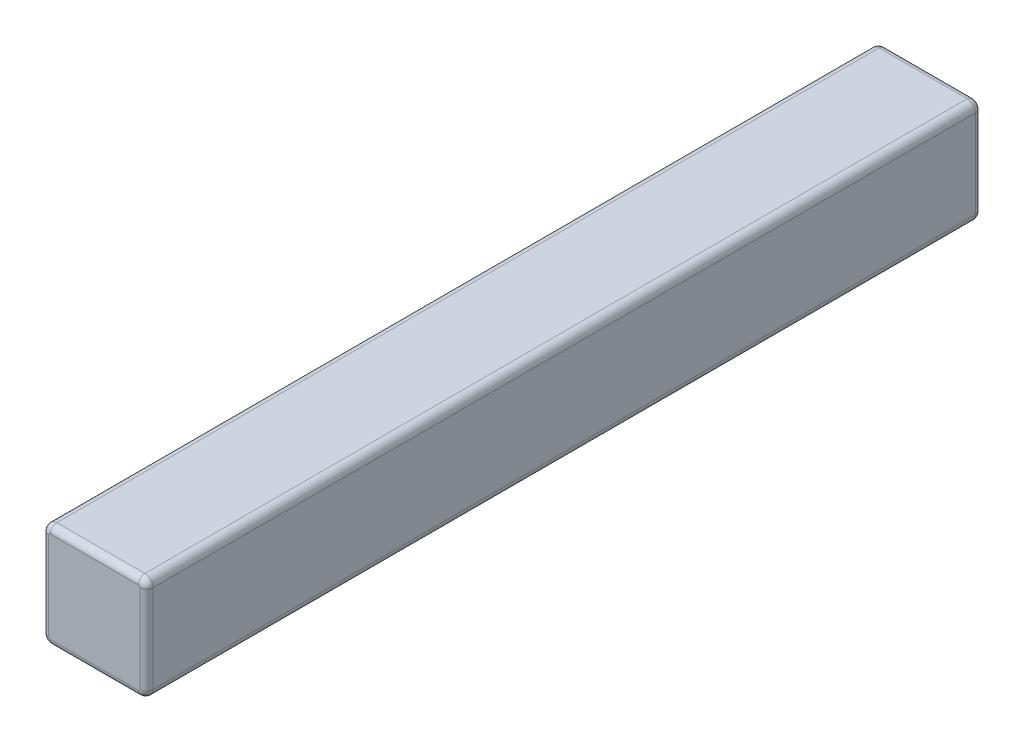
ISO-10303-21;
HEADER;
FILE_DESCRIPTION(('STEP AP214'),'2;1');
FILE_NAME('part.step','',(''),(''),'','','');
FILE_SCHEMA(('AUTOMOTIVE_DESIGN { 1 0 10303 214 1 1 1 1 }'));
ENDSEC;
DATA;
#1=APPLICATION_CONTEXT('core data for automotive mechanical design processes');
#2=APPLICATION_PROTOCOL_DEFINITION('international standard','automotive_design',2000,#1);
#3=PRODUCT_CONTEXT('',#1,'mechanical');
#4=PRODUCT('Part','Part','',(#3));
#5=PRODUCT_RELATED_PRODUCT_CATEGORY('part','',(#4));
#6=PRODUCT_DEFINITION_FORMATION('','',#4);
#7=PRODUCT_DEFINITION_CONTEXT('part definition',#1,'design');
#8=PRODUCT_DEFINITION('design','',#6,#7);
#9=PRODUCT_DEFINITION_SHAPE('','',#8);
#10=(LENGTH_UNIT() NAMED_UNIT(*) SI_UNIT(.MILLI.,.METRE.));
#11=(NAMED_UNIT(*) PLANE_ANGLE_UNIT() SI_UNIT($,.RADIAN.));
#12=(NAMED_UNIT(*) SI_UNIT($,.STERADIAN.) SOLID_ANGLE_UNIT());
#13=UNCERTAINTY_MEASURE_WITH_UNIT(LENGTH_MEASURE(1.E-05),#10,'distance_accuracy_value','');
#14=(GEOMETRIC_REPRESENTATION_CONTEXT(3) GLOBAL_UNCERTAINTY_ASSIGNED_CONTEXT((#13)) GLOBAL_UNIT_ASSIGNED_CONTEXT((#10,
#11,#12)) REPRESENTATION_CONTEXT('',''));
#15=CARTESIAN_POINT('',(0.,0.,0.));
#16=DIRECTION('',(0.,0.,1.));
#17=DIRECTION('',(1.,0.,0.));
#18=AXIS2_PLACEMENT_3D('',#15,#16,#17);
#19=CARTESIAN_POINT('',(-1.3375,1.3375,25.4));
#20=DIRECTION('',(0.,0.,-1.));
#21=DIRECTION('',(-1.,0.,0.));
#22=AXIS2_PLACEMENT_3D('',#19,#20,#21);
#23=CYLINDRICAL_SURFACE('',#22,0.25);
#24=DIRECTION('',(0.,0.,-1.));
#25=VECTOR('',#24,1.);
#26=CARTESIAN_POINT('',(-1.3375,1.5875,25.4));
#27=LINE('',#26,#25);
#28=CARTESIAN_POINT('',(-1.3375,1.5875,25.2));
#29=VERTEX_POINT('',#28);
#30=CARTESIAN_POINT('',(-1.3375,1.5875,0.199999999999999));
#31=VERTEX_POINT('',#30);
#32=EDGE_CURVE('E267',#29,#31,#27,.T.);
#33=ORIENTED_EDGE('',*,*,#32,.T.);
#34=CARTESIAN_POINT('',(-1.3375,1.3375,0.199999999999999));
#35=DIRECTION('',(0.,0.,1.));
#36=DIRECTION('',(1.,0.,0.));
#37=AXIS2_PLACEMENT_3D('',#34,#35,#36);
#38=CIRCLE('',#37,0.25);
#39=CARTESIAN_POINT('',(-1.5875,1.3375,0.199999999999999));
#40=VERTEX_POINT('',#39);
#41=EDGE_CURVE('E232',#31,#40,#38,.T.);
#42=ORIENTED_EDGE('',*,*,#41,.T.);
#43=DIRECTION('',(0.,0.,-1.));
#44=VECTOR('',#43,1.);
#45=CARTESIAN_POINT('',(-1.5875,1.3375,25.4));
#46=LINE('',#45,#44);
#47=CARTESIAN_POINT('',(-1.5875,1.3375,25.2));
#48=VERTEX_POINT('',#47);
#49=EDGE_CURVE('E171',#48,#40,#46,.T.);
#50=ORIENTED_EDGE('',*,*,#49,.F.);
#51=CARTESIAN_POINT('',(-1.3375,1.3375,25.2));
#52=DIRECTION('',(0.,0.,1.));
#53=DIRECTION('',(1.,0.,0.));
#54=AXIS2_PLACEMENT_3D('',#51,#52,#53);
#55=CIRCLE('',#54,0.25);
#56=EDGE_CURVE('E230',#48,#29,#55,.F.);
#57=ORIENTED_EDGE('',*,*,#56,.T.);
#58=EDGE_LOOP('',(#33,#42,#50,#57));
#59=FACE_BOUND('',#58,.T.);
#60=ADVANCED_FACE('F35',(#59),#23,.T.);
#61=CARTESIAN_POINT('',(-1.5875,1.3375,25.4));
#62=DIRECTION('',(1.,0.,0.));
#63=DIRECTION('',(0.,0.,-1.));
#64=AXIS2_PLACEMENT_3D('',#61,#62,#63);
#65=PLANE('',#64);
#66=ORIENTED_EDGE('',*,*,#49,.T.);
#67=DIRECTION('',(0.,-1.,0.));
#68=VECTOR('',#67,1.);
#69=CARTESIAN_POINT('',(-1.5875,1.3375,0.199999999999999));
#70=LINE('',#69,#68);
#71=CARTESIAN_POINT('',(-1.5875,-1.3375,0.199999999999999));
#72=VERTEX_POINT('',#71);
#73=EDGE_CURVE('E170',#40,#72,#70,.T.);
#74=ORIENTED_EDGE('',*,*,#73,.T.);
#75=DIRECTION('',(0.,0.,-1.));
#76=VECTOR('',#75,1.);
#77=CARTESIAN_POINT('',(-1.5875,-1.3375,25.4));
#78=LINE('',#77,#76);
#79=CARTESIAN_POINT('',(-1.5875,-1.3375,25.2));
#80=VERTEX_POINT('',#79);
#81=EDGE_CURVE('E152',#80,#72,#78,.T.);
#82=ORIENTED_EDGE('',*,*,#81,.F.);
#83=DIRECTION('',(0.,-1.,0.));
#84=VECTOR('',#83,1.);
#85=CARTESIAN_POINT('',(-1.5875,1.3375,25.2));
#86=LINE('',#85,#84);
#87=EDGE_CURVE('E167',#80,#48,#86,.F.);
#88=ORIENTED_EDGE('',*,*,#87,.T.);
#89=EDGE_LOOP('',(#66,#74,#82,#88));
#90=FACE_BOUND('',#89,.T.);
#91=ADVANCED_FACE('F165',(#90),#65,.F.);
#92=CARTESIAN_POINT('',(-1.3375,-1.3375,25.4));
#93=DIRECTION('',(0.,0.,-1.));
#94=DIRECTION('',(-1.,0.,0.));
#95=AXIS2_PLACEMENT_3D('',#92,#93,#94);
#96=CYLINDRICAL_SURFACE('',#95,0.25);
#97=ORIENTED_EDGE('',*,*,#81,.T.);
#98=CARTESIAN_POINT('',(-1.3375,-1.3375,0.199999999999999));
#99=DIRECTION('',(0.,0.,1.));
#100=DIRECTION('',(1.,0.,0.));
#101=AXIS2_PLACEMENT_3D('',#98,#99,#100);
#102=CIRCLE('',#101,0.25);
#103=CARTESIAN_POINT('',(-1.3375,-1.5875,0.199999999999999));
#104=VERTEX_POINT('',#103);
#105=EDGE_CURVE('E159',#72,#104,#102,.T.);
#106=ORIENTED_EDGE('',*,*,#105,.T.);
#107=DIRECTION('',(0.,0.,-1.));
#108=VECTOR('',#107,1.);
#109=CARTESIAN_POINT('',(-1.3375,-1.5875,25.4));
#110=LINE('',#109,#108);
#111=CARTESIAN_POINT('',(-1.3375,-1.5875,25.2));
#112=VERTEX_POINT('',#111);
#113=EDGE_CURVE('E154',#112,#104,#110,.T.);
#114=ORIENTED_EDGE('',*,*,#113,.F.);
#115=CARTESIAN_POINT('',(-1.3375,-1.3375,25.2));
#116=DIRECTION('',(0.,0.,1.));
#117=DIRECTION('',(1.,0.,0.));
#118=AXIS2_PLACEMENT_3D('',#115,#116,#117);
#119=CIRCLE('',#118,0.25);
#120=EDGE_CURVE('E149',#112,#80,#119,.F.);
#121=ORIENTED_EDGE('',*,*,#120,.T.);
#122=EDGE_LOOP('',(#97,#106,#114,#121));
#123=FACE_BOUND('',#122,.T.);
#124=ADVANCED_FACE('F151',(#123),#96,.T.);
#125=CARTESIAN_POINT('',(-1.3375,-1.5875,25.4));
#126=DIRECTION('',(0.,1.,0.));
#127=DIRECTION('',(-1.,0.,0.));
#128=AXIS2_PLACEMENT_3D('',#125,#126,#127);
#129=PLANE('',#128);
#130=ORIENTED_EDGE('',*,*,#113,.T.);
#131=DIRECTION('',(1.,0.,0.));
#132=VECTOR('',#131,1.);
#133=CARTESIAN_POINT('',(-1.3375,-1.5875,0.199999999999999));
#134=LINE('',#133,#132);
#135=CARTESIAN_POINT('',(1.3375,-1.5875,0.199999999999999));
#136=VERTEX_POINT('',#135);
#137=EDGE_CURVE('E211',#104,#136,#134,.T.);
#138=ORIENTED_EDGE('',*,*,#137,.T.);
#139=DIRECTION('',(0.,0.,-1.));
#140=VECTOR('',#139,1.);
#141=CARTESIAN_POINT('',(1.3375,-1.5875,25.4));
#142=LINE('',#141,#140);
#143=CARTESIAN_POINT('',(1.3375,-1.5875,25.2));
#144=VERTEX_POINT('',#143);
#145=EDGE_CURVE('E311',#144,#136,#142,.T.);
#146=ORIENTED_EDGE('',*,*,#145,.F.);
#147=DIRECTION('',(1.,0.,0.));
#148=VECTOR('',#147,1.);
#149=CARTESIAN_POINT('',(-1.3375,-1.5875,25.2));
#150=LINE('',#149,#148);
#151=EDGE_CURVE('E209',#144,#112,#150,.F.);
#152=ORIENTED_EDGE('',*,*,#151,.T.);
#153=EDGE_LOOP('',(#130,#138,#146,#152));
#154=FACE_BOUND('',#153,.T.);
#155=ADVANCED_FACE('F316',(#154),#129,.F.);
#156=CARTESIAN_POINT('',(1.3375,-1.3375,25.4));
#157=DIRECTION('',(0.,0.,-1.));
#158=DIRECTION('',(-1.,0.,0.));
#159=AXIS2_PLACEMENT_3D('',#156,#157,#158);
#160=CYLINDRICAL_SURFACE('',#159,0.25);
#161=ORIENTED_EDGE('',*,*,#145,.T.);
#162=CARTESIAN_POINT('',(1.3375,-1.3375,0.199999999999999));
#163=DIRECTION('',(0.,0.,1.));
#164=DIRECTION('',(1.,0.,0.));
#165=AXIS2_PLACEMENT_3D('',#162,#163,#164);
#166=CIRCLE('',#165,0.25);
#167=CARTESIAN_POINT('',(1.5875,-1.3375,0.199999999999999));
#168=VERTEX_POINT('',#167);
#169=EDGE_CURVE('E215',#136,#168,#166,.T.);
#170=ORIENTED_EDGE('',*,*,#169,.T.);
#171=DIRECTION('',(0.,0.,-1.));
#172=VECTOR('',#171,1.);
#173=CARTESIAN_POINT('',(1.5875,-1.3375,25.4));
#174=LINE('',#173,#172);
#175=CARTESIAN_POINT('',(1.5875,-1.3375,25.2));
#176=VERTEX_POINT('',#175);
#177=EDGE_CURVE('E308',#176,#168,#174,.T.);
#178=ORIENTED_EDGE('',*,*,#177,.F.);
#179=CARTESIAN_POINT('',(1.3375,-1.3375,25.2));
#180=DIRECTION('',(0.,0.,1.));
#181=DIRECTION('',(1.,0.,0.));
#182=AXIS2_PLACEMENT_3D('',#179,#180,#181);
#183=CIRCLE('',#182,0.25);
#184=EDGE_CURVE('E213',#176,#144,#183,.F.);
#185=ORIENTED_EDGE('',*,*,#184,.T.);
#186=EDGE_LOOP('',(#161,#170,#178,#185));
#187=FACE_BOUND('',#186,.T.);
#188=ADVANCED_FACE('F358',(#187),#160,.T.);
#189=CARTESIAN_POINT('',(1.5875,1.3375,25.4));
#190=DIRECTION('',(1.,0.,0.));
#191=DIRECTION('',(0.,1.,0.));
#192=AXIS2_PLACEMENT_3D('',#189,#190,#191);
#193=PLANE('',#192);
#194=ORIENTED_EDGE('',*,*,#177,.T.);
#195=DIRECTION('',(0.,-1.,0.));
#196=VECTOR('',#195,1.);
#197=CARTESIAN_POINT('',(1.5875,1.3375,0.2));
#198=LINE('',#197,#196);
#199=CARTESIAN_POINT('',(1.5875,1.3375,0.199999999999999));
#200=VERTEX_POINT('',#199);
#201=EDGE_CURVE('E219',#168,#200,#198,.F.);
#202=ORIENTED_EDGE('',*,*,#201,.T.);
#203=DIRECTION('',(0.,0.,-1.));
#204=VECTOR('',#203,1.);
#205=CARTESIAN_POINT('',(1.5875,1.3375,25.4));
#206=LINE('',#205,#204);
#207=CARTESIAN_POINT('',(1.5875,1.3375,25.2));
#208=VERTEX_POINT('',#207);
#209=EDGE_CURVE('E303',#208,#200,#206,.T.);
#210=ORIENTED_EDGE('',*,*,#209,.F.);
#211=DIRECTION('',(0.,-1.,0.));
#212=VECTOR('',#211,1.);
#213=CARTESIAN_POINT('',(1.5875,1.3375,25.2));
#214=LINE('',#213,#212);
#215=EDGE_CURVE('E217',#208,#176,#214,.T.);
#216=ORIENTED_EDGE('',*,*,#215,.T.);
#217=EDGE_LOOP('',(#194,#202,#210,#216));
#218=FACE_BOUND('',#217,.T.);
#219=ADVANCED_FACE('F360',(#218),#193,.T.);
#220=CARTESIAN_POINT('',(1.3375,1.3375,25.4));
#221=DIRECTION('',(0.,0.,-1.));
#222=DIRECTION('',(-1.,0.,0.));
#223=AXIS2_PLACEMENT_3D('',#220,#221,#222);
#224=CYLINDRICAL_SURFACE('',#223,0.25);
#225=ORIENTED_EDGE('',*,*,#209,.T.);
#226=CARTESIAN_POINT('',(1.3375,1.3375,0.199999999999999));
#227=DIRECTION('',(0.,0.,1.));
#228=DIRECTION('',(1.,0.,0.));
#229=AXIS2_PLACEMENT_3D('',#226,#227,#228);
#230=CIRCLE('',#229,0.25);
#231=CARTESIAN_POINT('',(1.3375,1.5875,0.199999999999999));
#232=VERTEX_POINT('',#231);
#233=EDGE_CURVE('E223',#200,#232,#230,.T.);
#234=ORIENTED_EDGE('',*,*,#233,.T.);
#235=DIRECTION('',(0.,0.,-1.));
#236=VECTOR('',#235,1.);
#237=CARTESIAN_POINT('',(1.3375,1.5875,25.4));
#238=LINE('',#237,#236);
#239=CARTESIAN_POINT('',(1.3375,1.5875,25.2));
#240=VERTEX_POINT('',#239);
#241=EDGE_CURVE('E301',#240,#232,#238,.T.);
#242=ORIENTED_EDGE('',*,*,#241,.F.);
#243=CARTESIAN_POINT('',(1.3375,1.3375,25.2));
#244=DIRECTION('',(0.,0.,1.));
#245=DIRECTION('',(1.,0.,0.));
#246=AXIS2_PLACEMENT_3D('',#243,#244,#245);
#247=CIRCLE('',#246,0.25);
#248=EDGE_CURVE('E221',#240,#208,#247,.F.);
#249=ORIENTED_EDGE('',*,*,#248,.T.);
#250=EDGE_LOOP('',(#225,#234,#242,#249));
#251=FACE_BOUND('',#250,.T.);
#252=ADVANCED_FACE('F411',(#251),#224,.T.);
#253=CARTESIAN_POINT('',(-1.3375,1.5875,25.4));
#254=DIRECTION('',(0.,1.,0.));
#255=DIRECTION('',(-1.,0.,0.));
#256=AXIS2_PLACEMENT_3D('',#253,#254,#255);
#257=PLANE('',#256);
#258=ORIENTED_EDGE('',*,*,#241,.T.);
#259=DIRECTION('',(1.,0.,0.));
#260=VECTOR('',#259,1.);
#261=CARTESIAN_POINT('',(-1.3375,1.5875,0.2));
#262=LINE('',#261,#260);
#263=EDGE_CURVE('E228',#232,#31,#262,.F.);
#264=ORIENTED_EDGE('',*,*,#263,.T.);
#265=ORIENTED_EDGE('',*,*,#32,.F.);
#266=DIRECTION('',(1.,0.,0.));
#267=VECTOR('',#266,1.);
#268=CARTESIAN_POINT('',(-1.3375,1.5875,25.2));
#269=LINE('',#268,#267);
#270=EDGE_CURVE('E225',#29,#240,#269,.T.);
#271=ORIENTED_EDGE('',*,*,#270,.T.);
#272=EDGE_LOOP('',(#258,#264,#265,#271));
#273=FACE_BOUND('',#272,.T.);
#274=ADVANCED_FACE('F298',(#273),#257,.T.);
#275=CARTESIAN_POINT('',(-1.3375,1.3375,25.4));
#276=DIRECTION('',(0.,0.,1.));
#277=DIRECTION('',(1.,0.,0.));
#278=AXIS2_PLACEMENT_3D('',#275,#276,#277);
#279=PLANE('',#278);
#280=CARTESIAN_POINT('',(1.3375,1.3375,25.4));
#281=DIRECTION('',(0.,0.,1.));
#282=DIRECTION('',(1.,0.,0.));
#283=AXIS2_PLACEMENT_3D('',#280,#281,#282);
#284=CIRCLE('',#283,0.0499999999999999);
#285=CARTESIAN_POINT('',(1.3875,1.3375,25.4));
#286=VERTEX_POINT('',#285);
#287=CARTESIAN_POINT('',(1.3375,1.3875,25.4));
#288=VERTEX_POINT('',#287);
#289=EDGE_CURVE('E44',#286,#288,#284,.T.);
#290=ORIENTED_EDGE('',*,*,#289,.T.);
#291=DIRECTION('',(1.,0.,0.));
#292=VECTOR('',#291,1.);
#293=CARTESIAN_POINT('',(-1.3375,1.3875,25.4));
#294=LINE('',#293,#292);
#295=CARTESIAN_POINT('',(-1.3375,1.3875,25.4));
#296=VERTEX_POINT('',#295);
#297=EDGE_CURVE('E11',#288,#296,#294,.F.);
#298=ORIENTED_EDGE('',*,*,#297,.T.);
#299=CARTESIAN_POINT('',(-1.3375,1.3375,25.4));
#300=DIRECTION('',(0.,0.,1.));
#301=DIRECTION('',(1.,0.,0.));
#302=AXIS2_PLACEMENT_3D('',#299,#300,#301);
#303=CIRCLE('',#302,0.0500000000000001);
#304=CARTESIAN_POINT('',(-1.3875,1.3375,25.4));
#305=VERTEX_POINT('',#304);
#306=EDGE_CURVE('E234',#296,#305,#303,.T.);
#307=ORIENTED_EDGE('',*,*,#306,.T.);
#308=DIRECTION('',(0.,-1.,0.));
#309=VECTOR('',#308,1.);
#310=CARTESIAN_POINT('',(-1.3875,-1.3375,25.4));
#311=LINE('',#310,#309);
#312=CARTESIAN_POINT('',(-1.3875,-1.3375,25.4));
#313=VERTEX_POINT('',#312);
#314=EDGE_CURVE('E236',#305,#313,#311,.T.);
#315=ORIENTED_EDGE('',*,*,#314,.T.);
#316=CARTESIAN_POINT('',(-1.3375,-1.3375,25.4));
#317=DIRECTION('',(0.,0.,1.));
#318=DIRECTION('',(1.,0.,0.));
#319=AXIS2_PLACEMENT_3D('',#316,#317,#318);
#320=CIRCLE('',#319,0.05);
#321=CARTESIAN_POINT('',(-1.3375,-1.3875,25.4));
#322=VERTEX_POINT('',#321);
#323=EDGE_CURVE('E177',#313,#322,#320,.T.);
#324=ORIENTED_EDGE('',*,*,#323,.T.);
#325=DIRECTION('',(1.,0.,0.));
#326=VECTOR('',#325,1.);
#327=CARTESIAN_POINT('',(1.3375,-1.3875,25.4));
#328=LINE('',#327,#326);
#329=CARTESIAN_POINT('',(1.3375,-1.3875,25.4));
#330=VERTEX_POINT('',#329);
#331=EDGE_CURVE('E239',#322,#330,#328,.T.);
#332=ORIENTED_EDGE('',*,*,#331,.T.);
#333=CARTESIAN_POINT('',(1.3375,-1.3375,25.4));
#334=DIRECTION('',(0.,0.,1.));
#335=DIRECTION('',(1.,0.,0.));
#336=AXIS2_PLACEMENT_3D('',#333,#334,#335);
#337=CIRCLE('',#336,0.0499999999999997);
#338=CARTESIAN_POINT('',(1.3875,-1.3375,25.4));
#339=VERTEX_POINT('',#338);
#340=EDGE_CURVE('E241',#330,#339,#337,.T.);
#341=ORIENTED_EDGE('',*,*,#340,.T.);
#342=DIRECTION('',(0.,-1.,0.));
#343=VECTOR('',#342,1.);
#344=CARTESIAN_POINT('',(1.3875,1.3375,25.4));
#345=LINE('',#344,#343);
#346=EDGE_CURVE('E55',#339,#286,#345,.F.);
#347=ORIENTED_EDGE('',*,*,#346,.T.);
#348=EDGE_LOOP('',(#290,#298,#307,#315,#324,#332,#341,#347));
#349=FACE_BOUND('',#348,.T.);
#350=ADVANCED_FACE('F285',(#349),#279,.T.);
#351=CARTESIAN_POINT('',(-1.3375,1.3375,0.));
#352=DIRECTION('',(0.,0.,1.));
#353=DIRECTION('',(1.,0.,0.));
#354=AXIS2_PLACEMENT_3D('',#351,#352,#353);
#355=PLANE('',#354);
#356=CARTESIAN_POINT('',(-1.3375,-1.3375,0.));
#357=DIRECTION('',(0.,0.,1.));
#358=DIRECTION('',(1.,0.,0.));
#359=AXIS2_PLACEMENT_3D('',#356,#357,#358);
#360=CIRCLE('',#359,0.05);
#361=CARTESIAN_POINT('',(-1.3375,-1.3875,0.));
#362=VERTEX_POINT('',#361);
#363=CARTESIAN_POINT('',(-1.3875,-1.3375,0.));
#364=VERTEX_POINT('',#363);
#365=EDGE_CURVE('E204',#362,#364,#360,.F.);
#366=ORIENTED_EDGE('',*,*,#365,.T.);
#367=DIRECTION('',(0.,-1.,0.));
#368=VECTOR('',#367,1.);
#369=CARTESIAN_POINT('',(-1.3875,1.3375,0.));
#370=LINE('',#369,#368);
#371=CARTESIAN_POINT('',(-1.3875,1.3375,0.));
#372=VERTEX_POINT('',#371);
#373=EDGE_CURVE('E160',#364,#372,#370,.F.);
#374=ORIENTED_EDGE('',*,*,#373,.T.);
#375=CARTESIAN_POINT('',(-1.3375,1.3375,0.));
#376=DIRECTION('',(0.,0.,1.));
#377=DIRECTION('',(1.,0.,0.));
#378=AXIS2_PLACEMENT_3D('',#375,#376,#377);
#379=CIRCLE('',#378,0.0500000000000001);
#380=CARTESIAN_POINT('',(-1.3375,1.3875,0.));
#381=VERTEX_POINT('',#380);
#382=EDGE_CURVE('E189',#372,#381,#379,.F.);
#383=ORIENTED_EDGE('',*,*,#382,.T.);
#384=DIRECTION('',(1.,0.,0.));
#385=VECTOR('',#384,1.);
#386=CARTESIAN_POINT('',(1.3375,1.3875,0.));
#387=LINE('',#386,#385);
#388=CARTESIAN_POINT('',(1.3375,1.3875,0.));
#389=VERTEX_POINT('',#388);
#390=EDGE_CURVE('E194',#381,#389,#387,.T.);
#391=ORIENTED_EDGE('',*,*,#390,.T.);
#392=CARTESIAN_POINT('',(1.3375,1.3375,0.));
#393=DIRECTION('',(0.,0.,1.));
#394=DIRECTION('',(1.,0.,0.));
#395=AXIS2_PLACEMENT_3D('',#392,#393,#394);
#396=CIRCLE('',#395,0.0499999999999999);
#397=CARTESIAN_POINT('',(1.3875,1.3375,0.));
#398=VERTEX_POINT('',#397);
#399=EDGE_CURVE('E196',#389,#398,#396,.F.);
#400=ORIENTED_EDGE('',*,*,#399,.T.);
#401=DIRECTION('',(0.,-1.,0.));
#402=VECTOR('',#401,1.);
#403=CARTESIAN_POINT('',(1.3875,-1.3375,0.));
#404=LINE('',#403,#402);
#405=CARTESIAN_POINT('',(1.3875,-1.3375,0.));
#406=VERTEX_POINT('',#405);
#407=EDGE_CURVE('E198',#398,#406,#404,.T.);
#408=ORIENTED_EDGE('',*,*,#407,.T.);
#409=CARTESIAN_POINT('',(1.3375,-1.3375,0.));
#410=DIRECTION('',(0.,0.,1.));
#411=DIRECTION('',(1.,0.,0.));
#412=AXIS2_PLACEMENT_3D('',#409,#410,#411);
#413=CIRCLE('',#412,0.0499999999999997);
#414=CARTESIAN_POINT('',(1.3375,-1.3875,0.));
#415=VERTEX_POINT('',#414);
#416=EDGE_CURVE('E200',#406,#415,#413,.F.);
#417=ORIENTED_EDGE('',*,*,#416,.T.);
#418=DIRECTION('',(1.,0.,0.));
#419=VECTOR('',#418,1.);
#420=CARTESIAN_POINT('',(-1.3375,-1.3875,0.));
#421=LINE('',#420,#419);
#422=EDGE_CURVE('E202',#415,#362,#421,.F.);
#423=ORIENTED_EDGE('',*,*,#422,.T.);
#424=EDGE_LOOP('',(#366,#374,#383,#391,#400,#408,#417,#423));
#425=FACE_BOUND('',#424,.T.);
#426=ADVANCED_FACE('F330',(#425),#355,.F.);
#427=CARTESIAN_POINT('',(1.3875,1.3375,0.2));
#428=DIRECTION('',(0.,1.,0.));
#429=DIRECTION('',(-1.,0.,0.));
#430=AXIS2_PLACEMENT_3D('',#427,#428,#429);
#431=CYLINDRICAL_SURFACE('',#430,0.2);
#432=CARTESIAN_POINT('',(1.3875,-1.3375,0.2));
#433=DIRECTION('',(0.,-1.,0.));
#434=DIRECTION('',(0.,0.,-1.));
#435=AXIS2_PLACEMENT_3D('',#432,#433,#434);
#436=CIRCLE('',#435,0.2);
#437=EDGE_CURVE('E261',#406,#168,#436,.T.);
#438=ORIENTED_EDGE('',*,*,#437,.F.);
#439=ORIENTED_EDGE('',*,*,#407,.F.);
#440=CARTESIAN_POINT('',(1.3875,1.3375,0.2));
#441=DIRECTION('',(0.,1.,0.));
#442=DIRECTION('',(0.,0.,1.));
#443=AXIS2_PLACEMENT_3D('',#440,#441,#442);
#444=CIRCLE('',#443,0.2);
#445=EDGE_CURVE('E264',#200,#398,#444,.T.);
#446=ORIENTED_EDGE('',*,*,#445,.F.);
#447=ORIENTED_EDGE('',*,*,#201,.F.);
#448=EDGE_LOOP('',(#438,#439,#446,#447));
#449=FACE_BOUND('',#448,.T.);
#450=ADVANCED_FACE('F350',(#449),#431,.T.);
#451=CARTESIAN_POINT('',(1.3375,1.3375,0.199999999999999));
#452=DIRECTION('',(0.,0.,1.));
#453=DIRECTION('',(1.,0.,0.));
#454=AXIS2_PLACEMENT_3D('',#451,#452,#453);
#455=DEGENERATE_TOROIDAL_SURFACE('',#454,0.0499999999999999,0.2,.T.);
#456=ORIENTED_EDGE('',*,*,#445,.T.);
#457=ORIENTED_EDGE('',*,*,#399,.F.);
#458=CARTESIAN_POINT('',(1.3375,1.3875,0.199999999999999));
#459=DIRECTION('',(-1.,0.,0.));
#460=DIRECTION('',(0.,-1.,0.));
#461=AXIS2_PLACEMENT_3D('',#458,#459,#460);
#462=CIRCLE('',#461,0.2);
#463=EDGE_CURVE('E258',#232,#389,#462,.T.);
#464=ORIENTED_EDGE('',*,*,#463,.F.);
#465=ORIENTED_EDGE('',*,*,#233,.F.);
#466=EDGE_LOOP('',(#456,#457,#464,#465));
#467=FACE_BOUND('',#466,.T.);
#468=ADVANCED_FACE('F345',(#467),#455,.T.);
#469=CARTESIAN_POINT('',(1.3375,-1.3375,0.199999999999999));
#470=DIRECTION('',(0.,0.,1.));
#471=DIRECTION('',(1.,0.,0.));
#472=AXIS2_PLACEMENT_3D('',#469,#470,#471);
#473=DEGENERATE_TOROIDAL_SURFACE('',#472,0.0499999999999997,0.2,.T.);
#474=ORIENTED_EDGE('',*,*,#437,.T.);
#475=ORIENTED_EDGE('',*,*,#169,.F.);
#476=CARTESIAN_POINT('',(1.3375,-1.3875,0.2));
#477=DIRECTION('',(-1.,0.,0.));
#478=DIRECTION('',(0.,0.,1.));
#479=AXIS2_PLACEMENT_3D('',#476,#477,#478);
#480=CIRCLE('',#479,0.2);
#481=EDGE_CURVE('E255',#415,#136,#480,.T.);
#482=ORIENTED_EDGE('',*,*,#481,.F.);
#483=ORIENTED_EDGE('',*,*,#416,.F.);
#484=EDGE_LOOP('',(#474,#475,#482,#483));
#485=FACE_BOUND('',#484,.T.);
#486=ADVANCED_FACE('F355',(#485),#473,.T.);
#487=CARTESIAN_POINT('',(-1.3375,1.3875,0.2));
#488=DIRECTION('',(-1.,0.,0.));
#489=DIRECTION('',(0.,-1.,0.));
#490=AXIS2_PLACEMENT_3D('',#487,#488,#489);
#491=CYLINDRICAL_SURFACE('',#490,0.2);
#492=ORIENTED_EDGE('',*,*,#463,.T.);
#493=ORIENTED_EDGE('',*,*,#390,.F.);
#494=CARTESIAN_POINT('',(-1.3375,1.3875,0.2));
#495=DIRECTION('',(-1.,0.,0.));
#496=DIRECTION('',(0.,0.,1.));
#497=AXIS2_PLACEMENT_3D('',#494,#495,#496);
#498=CIRCLE('',#497,0.2);
#499=EDGE_CURVE('E252',#31,#381,#498,.T.);
#500=ORIENTED_EDGE('',*,*,#499,.F.);
#501=ORIENTED_EDGE('',*,*,#263,.F.);
#502=EDGE_LOOP('',(#492,#493,#500,#501));
#503=FACE_BOUND('',#502,.T.);
#504=ADVANCED_FACE('F341',(#503),#491,.T.);
#505=CARTESIAN_POINT('',(-1.3375,-1.3875,0.199999999999999));
#506=DIRECTION('',(1.,0.,0.));
#507=DIRECTION('',(0.,1.,0.));
#508=AXIS2_PLACEMENT_3D('',#505,#506,#507);
#509=CYLINDRICAL_SURFACE('',#508,0.2);
#510=ORIENTED_EDGE('',*,*,#481,.T.);
#511=ORIENTED_EDGE('',*,*,#137,.F.);
#512=CARTESIAN_POINT('',(-1.3375,-1.3875,0.2));
#513=DIRECTION('',(-1.,0.,0.));
#514=DIRECTION('',(0.,-1.,0.));
#515=AXIS2_PLACEMENT_3D('',#512,#513,#514);
#516=CIRCLE('',#515,0.2);
#517=EDGE_CURVE('E249',#362,#104,#516,.T.);
#518=ORIENTED_EDGE('',*,*,#517,.F.);
#519=ORIENTED_EDGE('',*,*,#422,.F.);
#520=EDGE_LOOP('',(#510,#511,#518,#519));
#521=FACE_BOUND('',#520,.T.);
#522=ADVANCED_FACE('F320',(#521),#509,.T.);
#523=CARTESIAN_POINT('',(-1.3375,1.3375,0.199999999999999));
#524=DIRECTION('',(0.,0.,1.));
#525=DIRECTION('',(1.,0.,0.));
#526=AXIS2_PLACEMENT_3D('',#523,#524,#525);
#527=DEGENERATE_TOROIDAL_SURFACE('',#526,0.0500000000000001,0.2,.T.);
#528=ORIENTED_EDGE('',*,*,#499,.T.);
#529=ORIENTED_EDGE('',*,*,#382,.F.);
#530=CARTESIAN_POINT('',(-1.3875,1.3375,0.199999999999999));
#531=DIRECTION('',(0.,-1.,0.));
#532=DIRECTION('',(0.,0.,-1.));
#533=AXIS2_PLACEMENT_3D('',#530,#531,#532);
#534=CIRCLE('',#533,0.2);
#535=EDGE_CURVE('E247',#40,#372,#534,.T.);
#536=ORIENTED_EDGE('',*,*,#535,.F.);
#537=ORIENTED_EDGE('',*,*,#41,.F.);
#538=EDGE_LOOP('',(#528,#529,#536,#537));
#539=FACE_BOUND('',#538,.T.);
#540=ADVANCED_FACE('F337',(#539),#527,.T.);
#541=CARTESIAN_POINT('',(-1.3375,-1.3375,0.199999999999999));
#542=DIRECTION('',(0.,0.,1.));
#543=DIRECTION('',(1.,0.,0.));
#544=AXIS2_PLACEMENT_3D('',#541,#542,#543);
#545=DEGENERATE_TOROIDAL_SURFACE('',#544,0.05,0.2,.T.);
#546=ORIENTED_EDGE('',*,*,#517,.T.);
#547=ORIENTED_EDGE('',*,*,#105,.F.);
#548=CARTESIAN_POINT('',(-1.3875,-1.3375,0.2));
#549=DIRECTION('',(0.,1.,0.));
#550=DIRECTION('',(0.,0.,1.));
#551=AXIS2_PLACEMENT_3D('',#548,#549,#550);
#552=CIRCLE('',#551,0.2);
#553=EDGE_CURVE('E245',#364,#72,#552,.T.);
#554=ORIENTED_EDGE('',*,*,#553,.F.);
#555=ORIENTED_EDGE('',*,*,#365,.F.);
#556=EDGE_LOOP('',(#546,#547,#554,#555));
#557=FACE_BOUND('',#556,.T.);
#558=ADVANCED_FACE('F326',(#557),#545,.T.);
#559=CARTESIAN_POINT('',(-1.3875,1.3375,0.199999999999999));
#560=DIRECTION('',(0.,-1.,0.));
#561=DIRECTION('',(0.,0.,-1.));
#562=AXIS2_PLACEMENT_3D('',#559,#560,#561);
#563=CYLINDRICAL_SURFACE('',#562,0.2);
#564=ORIENTED_EDGE('',*,*,#535,.T.);
#565=ORIENTED_EDGE('',*,*,#373,.F.);
#566=ORIENTED_EDGE('',*,*,#553,.T.);
#567=ORIENTED_EDGE('',*,*,#73,.F.);
#568=EDGE_LOOP('',(#564,#565,#566,#567));
#569=FACE_BOUND('',#568,.T.);
#570=ADVANCED_FACE('F332',(#569),#563,.T.);
#571=CARTESIAN_POINT('',(-1.3375,-1.3875,25.2));
#572=DIRECTION('',(-1.,0.,0.));
#573=DIRECTION('',(0.,-1.,0.));
#574=AXIS2_PLACEMENT_3D('',#571,#572,#573);
#575=CYLINDRICAL_SURFACE('',#574,0.2);
#576=CARTESIAN_POINT('',(1.3375,-1.3875,25.2));
#577=DIRECTION('',(1.,0.,0.));
#578=DIRECTION('',(0.,0.,-1.));
#579=AXIS2_PLACEMENT_3D('',#576,#577,#578);
#580=CIRCLE('',#579,0.2);
#581=EDGE_CURVE('E180',#330,#144,#580,.T.);
#582=ORIENTED_EDGE('',*,*,#581,.F.);
#583=ORIENTED_EDGE('',*,*,#331,.F.);
#584=CARTESIAN_POINT('',(-1.3375,-1.3875,25.2));
#585=DIRECTION('',(-1.,0.,0.));
#586=DIRECTION('',(0.,0.,1.));
#587=AXIS2_PLACEMENT_3D('',#584,#585,#586);
#588=CIRCLE('',#587,0.2);
#589=EDGE_CURVE('E39',#112,#322,#588,.T.);
#590=ORIENTED_EDGE('',*,*,#589,.F.);
#591=ORIENTED_EDGE('',*,*,#151,.F.);
#592=EDGE_LOOP('',(#582,#583,#590,#591));
#593=FACE_BOUND('',#592,.T.);
#594=ADVANCED_FACE('F37',(#593),#575,.T.);
#595=CARTESIAN_POINT('',(-1.3375,-1.3375,25.2));
#596=DIRECTION('',(0.,0.,1.));
#597=DIRECTION('',(1.,0.,0.));
#598=AXIS2_PLACEMENT_3D('',#595,#596,#597);
#599=DEGENERATE_TOROIDAL_SURFACE('',#598,0.05,0.2,.T.);
#600=ORIENTED_EDGE('',*,*,#589,.T.);
#601=ORIENTED_EDGE('',*,*,#323,.F.);
#602=CARTESIAN_POINT('',(-1.3875,-1.3375,25.2));
#603=DIRECTION('',(0.,1.,0.));
#604=DIRECTION('',(0.,0.,1.));
#605=AXIS2_PLACEMENT_3D('',#602,#603,#604);
#606=CIRCLE('',#605,0.2);
#607=EDGE_CURVE('E175',#80,#313,#606,.T.);
#608=ORIENTED_EDGE('',*,*,#607,.F.);
#609=ORIENTED_EDGE('',*,*,#120,.F.);
#610=EDGE_LOOP('',(#600,#601,#608,#609));
#611=FACE_BOUND('',#610,.T.);
#612=ADVANCED_FACE('F176',(#611),#599,.T.);
#613=CARTESIAN_POINT('',(1.3375,-1.3375,25.2));
#614=DIRECTION('',(0.,0.,1.));
#615=DIRECTION('',(1.,0.,0.));
#616=AXIS2_PLACEMENT_3D('',#613,#614,#615);
#617=DEGENERATE_TOROIDAL_SURFACE('',#616,0.0499999999999997,0.2,.T.);
#618=ORIENTED_EDGE('',*,*,#581,.T.);
#619=ORIENTED_EDGE('',*,*,#184,.F.);
#620=CARTESIAN_POINT('',(1.3875,-1.3375,25.2));
#621=DIRECTION('',(0.,1.,0.));
#622=DIRECTION('',(0.,0.,1.));
#623=AXIS2_PLACEMENT_3D('',#620,#621,#622);
#624=CIRCLE('',#623,0.2);
#625=EDGE_CURVE('E181',#339,#176,#624,.T.);
#626=ORIENTED_EDGE('',*,*,#625,.F.);
#627=ORIENTED_EDGE('',*,*,#340,.F.);
#628=EDGE_LOOP('',(#618,#619,#626,#627));
#629=FACE_BOUND('',#628,.T.);
#630=ADVANCED_FACE('F515',(#629),#617,.T.);
#631=CARTESIAN_POINT('',(-1.3875,1.3375,25.2));
#632=DIRECTION('',(0.,1.,0.));
#633=DIRECTION('',(0.,0.,1.));
#634=AXIS2_PLACEMENT_3D('',#631,#632,#633);
#635=CYLINDRICAL_SURFACE('',#634,0.2);
#636=ORIENTED_EDGE('',*,*,#607,.T.);
#637=ORIENTED_EDGE('',*,*,#314,.F.);
#638=CARTESIAN_POINT('',(-1.3875,1.3375,25.2));
#639=DIRECTION('',(0.,1.,0.));
#640=DIRECTION('',(0.,0.,1.));
#641=AXIS2_PLACEMENT_3D('',#638,#639,#640);
#642=CIRCLE('',#641,0.2);
#643=EDGE_CURVE('E186',#48,#305,#642,.T.);
#644=ORIENTED_EDGE('',*,*,#643,.F.);
#645=ORIENTED_EDGE('',*,*,#87,.F.);
#646=EDGE_LOOP('',(#636,#637,#644,#645));
#647=FACE_BOUND('',#646,.T.);
#648=ADVANCED_FACE('F184',(#647),#635,.T.);
#649=CARTESIAN_POINT('',(1.3875,1.3375,25.2));
#650=DIRECTION('',(0.,-1.,0.));
#651=DIRECTION('',(1.,0.,0.));
#652=AXIS2_PLACEMENT_3D('',#649,#650,#651);
#653=CYLINDRICAL_SURFACE('',#652,0.2);
#654=ORIENTED_EDGE('',*,*,#625,.T.);
#655=ORIENTED_EDGE('',*,*,#215,.F.);
#656=CARTESIAN_POINT('',(1.3875,1.3375,25.2));
#657=DIRECTION('',(0.,1.,0.));
#658=DIRECTION('',(0.,0.,1.));
#659=AXIS2_PLACEMENT_3D('',#656,#657,#658);
#660=CIRCLE('',#659,0.2);
#661=EDGE_CURVE('E272',#286,#208,#660,.T.);
#662=ORIENTED_EDGE('',*,*,#661,.F.);
#663=ORIENTED_EDGE('',*,*,#346,.F.);
#664=EDGE_LOOP('',(#654,#655,#662,#663));
#665=FACE_BOUND('',#664,.T.);
#666=ADVANCED_FACE('F364',(#665),#653,.T.);
#667=CARTESIAN_POINT('',(-1.3375,1.3375,25.2));
#668=DIRECTION('',(0.,0.,1.));
#669=DIRECTION('',(1.,0.,0.));
#670=AXIS2_PLACEMENT_3D('',#667,#668,#669);
#671=DEGENERATE_TOROIDAL_SURFACE('',#670,0.0500000000000001,0.2,.T.);
#672=ORIENTED_EDGE('',*,*,#643,.T.);
#673=ORIENTED_EDGE('',*,*,#306,.F.);
#674=CARTESIAN_POINT('',(-1.3375,1.3875,25.2));
#675=DIRECTION('',(1.,0.,0.));
#676=DIRECTION('',(0.,0.,-1.));
#677=AXIS2_PLACEMENT_3D('',#674,#675,#676);
#678=CIRCLE('',#677,0.2);
#679=EDGE_CURVE('E270',#29,#296,#678,.T.);
#680=ORIENTED_EDGE('',*,*,#679,.F.);
#681=ORIENTED_EDGE('',*,*,#56,.F.);
#682=EDGE_LOOP('',(#672,#673,#680,#681));
#683=FACE_BOUND('',#682,.T.);
#684=ADVANCED_FACE('F289',(#683),#671,.T.);
#685=CARTESIAN_POINT('',(1.3375,1.3375,25.2));
#686=DIRECTION('',(0.,0.,1.));
#687=DIRECTION('',(1.,0.,0.));
#688=AXIS2_PLACEMENT_3D('',#685,#686,#687);
#689=DEGENERATE_TOROIDAL_SURFACE('',#688,0.0499999999999999,0.2,.T.);
#690=ORIENTED_EDGE('',*,*,#661,.T.);
#691=ORIENTED_EDGE('',*,*,#248,.F.);
#692=CARTESIAN_POINT('',(1.3375,1.3875,25.2));
#693=DIRECTION('',(-1.,0.,0.));
#694=DIRECTION('',(0.,0.,1.));
#695=AXIS2_PLACEMENT_3D('',#692,#693,#694);
#696=CIRCLE('',#695,0.2);
#697=EDGE_CURVE('E268',#288,#240,#696,.T.);
#698=ORIENTED_EDGE('',*,*,#697,.F.);
#699=ORIENTED_EDGE('',*,*,#289,.F.);
#700=EDGE_LOOP('',(#690,#691,#698,#699));
#701=FACE_BOUND('',#700,.T.);
#702=ADVANCED_FACE('F367',(#701),#689,.T.);
#703=CARTESIAN_POINT('',(-1.3375,1.3875,25.2));
#704=DIRECTION('',(1.,0.,0.));
#705=DIRECTION('',(0.,1.,0.));
#706=AXIS2_PLACEMENT_3D('',#703,#704,#705);
#707=CYLINDRICAL_SURFACE('',#706,0.2);
#708=ORIENTED_EDGE('',*,*,#679,.T.);
#709=ORIENTED_EDGE('',*,*,#297,.F.);
#710=ORIENTED_EDGE('',*,*,#697,.T.);
#711=ORIENTED_EDGE('',*,*,#270,.F.);
#712=EDGE_LOOP('',(#708,#709,#710,#711));
#713=FACE_BOUND('',#712,.T.);
#714=ADVANCED_FACE('F370',(#713),#707,.T.);
#715=CLOSED_SHELL('',(#60,#91,#124,#155,#188,#219,#252,#274,#350,#426,#450,#468,#486,#504,#522,
#540,#558,#570,#594,#612,#630,#648,#666,#684,#702,#714));
#716=MANIFOLD_SOLID_BREP('B2',#715);
#717=ADVANCED_BREP_SHAPE_REPRESENTATION('',(#18,#716),#14);
#718=SHAPE_DEFINITION_REPRESENTATION(#9,#717);
ENDSEC;
END-ISO-10303-21;
